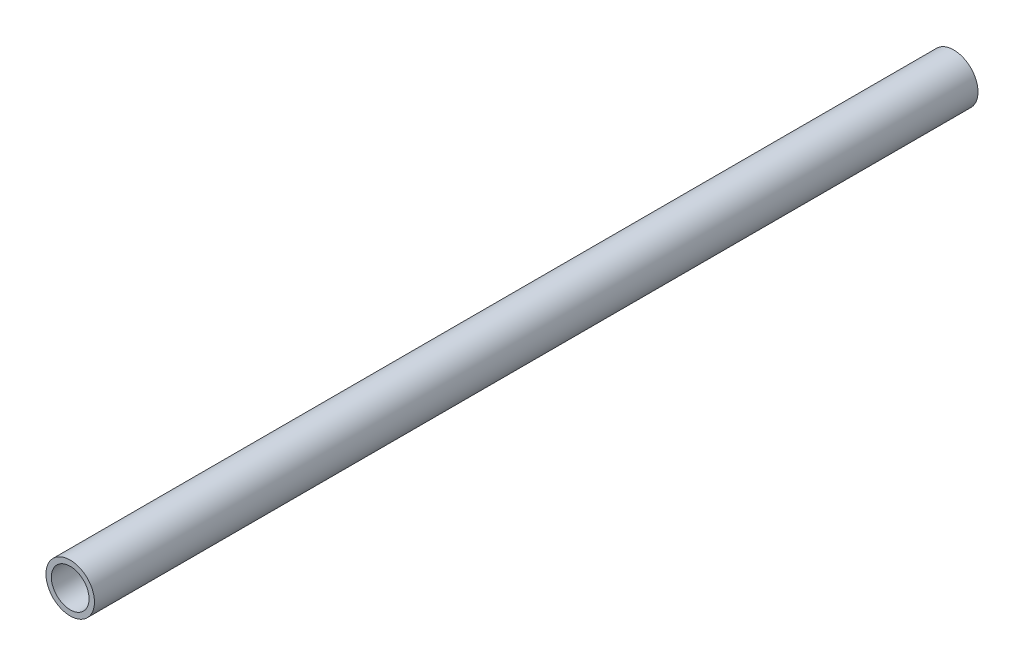
ISO-10303-21;
HEADER;
FILE_DESCRIPTION(('STEP AP214'),'2;1');
FILE_NAME('part.step','',(''),(''),'','','');
FILE_SCHEMA(('AUTOMOTIVE_DESIGN { 1 0 10303 214 1 1 1 1 }'));
ENDSEC;
DATA;
#1=APPLICATION_CONTEXT('core data for automotive mechanical design processes');
#2=APPLICATION_PROTOCOL_DEFINITION('international standard','automotive_design',2000,#1);
#3=PRODUCT_CONTEXT('',#1,'mechanical');
#4=PRODUCT('Part','Part','',(#3));
#5=PRODUCT_RELATED_PRODUCT_CATEGORY('part','',(#4));
#6=PRODUCT_DEFINITION_FORMATION('','',#4);
#7=PRODUCT_DEFINITION_CONTEXT('part definition',#1,'design');
#8=PRODUCT_DEFINITION('design','',#6,#7);
#9=PRODUCT_DEFINITION_SHAPE('','',#8);
#10=(LENGTH_UNIT() NAMED_UNIT(*) SI_UNIT(.MILLI.,.METRE.));
#11=(NAMED_UNIT(*) PLANE_ANGLE_UNIT() SI_UNIT($,.RADIAN.));
#12=(NAMED_UNIT(*) SI_UNIT($,.STERADIAN.) SOLID_ANGLE_UNIT());
#13=UNCERTAINTY_MEASURE_WITH_UNIT(LENGTH_MEASURE(1.E-05),#10,'distance_accuracy_value','');
#14=(GEOMETRIC_REPRESENTATION_CONTEXT(3) GLOBAL_UNCERTAINTY_ASSIGNED_CONTEXT((#13)) GLOBAL_UNIT_ASSIGNED_CONTEXT((#10,
#11,#12)) REPRESENTATION_CONTEXT('',''));
#15=CARTESIAN_POINT('',(0.,0.,0.));
#16=DIRECTION('',(0.,0.,1.));
#17=DIRECTION('',(1.,0.,0.));
#18=AXIS2_PLACEMENT_3D('',#15,#16,#17);
#19=CARTESIAN_POINT('',(0.,0.,327.978));
#20=DIRECTION('',(0.,0.,1.));
#21=DIRECTION('',(1.,0.,0.));
#22=AXIS2_PLACEMENT_3D('',#19,#20,#21);
#23=PLANE('',#22);
#24=CARTESIAN_POINT('',(0.,0.,327.978));
#25=DIRECTION('',(0.,0.,1.));
#26=DIRECTION('',(1.,0.,0.));
#27=AXIS2_PLACEMENT_3D('',#24,#25,#26);
#28=CIRCLE('',#27,9.);
#29=CARTESIAN_POINT('',(9.,0.,327.978));
#30=VERTEX_POINT('',#29);
#31=EDGE_CURVE('E10',#30,#30,#28,.T.);
#32=ORIENTED_EDGE('',*,*,#31,.T.);
#33=EDGE_LOOP('',(#32));
#34=FACE_BOUND('',#33,.T.);
#35=CARTESIAN_POINT('',(0.,0.,327.978));
#36=DIRECTION('',(0.,0.,1.));
#37=DIRECTION('',(1.,0.,0.));
#38=AXIS2_PLACEMENT_3D('',#35,#36,#37);
#39=CIRCLE('',#38,7.);
#40=CARTESIAN_POINT('',(7.,0.,327.978));
#41=VERTEX_POINT('',#40);
#42=EDGE_CURVE('E42',#41,#41,#39,.T.);
#43=ORIENTED_EDGE('',*,*,#42,.F.);
#44=EDGE_LOOP('',(#43));
#45=FACE_BOUND('',#44,.T.);
#46=ADVANCED_FACE('F31',(#34,#45),#23,.T.);
#47=CARTESIAN_POINT('',(0.,0.,0.));
#48=DIRECTION('',(0.,0.,1.));
#49=DIRECTION('',(1.,0.,0.));
#50=AXIS2_PLACEMENT_3D('',#47,#48,#49);
#51=PLANE('',#50);
#52=CARTESIAN_POINT('',(0.,0.,0.));
#53=DIRECTION('',(0.,0.,1.));
#54=DIRECTION('',(1.,0.,0.));
#55=AXIS2_PLACEMENT_3D('',#52,#53,#54);
#56=CIRCLE('',#55,9.);
#57=CARTESIAN_POINT('',(9.,0.,0.));
#58=VERTEX_POINT('',#57);
#59=EDGE_CURVE('E35',#58,#58,#56,.T.);
#60=ORIENTED_EDGE('',*,*,#59,.F.);
#61=EDGE_LOOP('',(#60));
#62=FACE_BOUND('',#61,.T.);
#63=CARTESIAN_POINT('',(0.,0.,0.));
#64=DIRECTION('',(0.,0.,1.));
#65=DIRECTION('',(1.,0.,0.));
#66=AXIS2_PLACEMENT_3D('',#63,#64,#65);
#67=CIRCLE('',#66,7.);
#68=CARTESIAN_POINT('',(7.,0.,0.));
#69=VERTEX_POINT('',#68);
#70=EDGE_CURVE('E44',#69,#69,#67,.T.);
#71=ORIENTED_EDGE('',*,*,#70,.T.);
#72=EDGE_LOOP('',(#71));
#73=FACE_BOUND('',#72,.T.);
#74=ADVANCED_FACE('F54',(#62,#73),#51,.F.);
#75=CARTESIAN_POINT('',(0.,0.,327.978));
#76=DIRECTION('',(0.,0.,-1.));
#77=DIRECTION('',(-1.,0.,0.));
#78=AXIS2_PLACEMENT_3D('',#75,#76,#77);
#79=CYLINDRICAL_SURFACE('',#78,9.);
#80=ORIENTED_EDGE('',*,*,#31,.F.);
#81=EDGE_LOOP('',(#80));
#82=FACE_BOUND('',#81,.T.);
#83=ORIENTED_EDGE('',*,*,#59,.T.);
#84=EDGE_LOOP('',(#83));
#85=FACE_BOUND('',#84,.T.);
#86=ADVANCED_FACE('F33',(#82,#85),#79,.T.);
#87=CARTESIAN_POINT('',(0.,0.,327.978));
#88=DIRECTION('',(0.,0.,-1.));
#89=DIRECTION('',(-1.,0.,0.));
#90=AXIS2_PLACEMENT_3D('',#87,#88,#89);
#91=CYLINDRICAL_SURFACE('',#90,7.);
#92=ORIENTED_EDGE('',*,*,#42,.T.);
#93=EDGE_LOOP('',(#92));
#94=FACE_BOUND('',#93,.T.);
#95=ORIENTED_EDGE('',*,*,#70,.F.);
#96=EDGE_LOOP('',(#95));
#97=FACE_BOUND('',#96,.T.);
#98=ADVANCED_FACE('F50',(#94,#97),#91,.F.);
#99=CLOSED_SHELL('',(#46,#74,#86,#98));
#100=MANIFOLD_SOLID_BREP('B2',#99);
#101=ADVANCED_BREP_SHAPE_REPRESENTATION('',(#18,#100),#14);
#102=SHAPE_DEFINITION_REPRESENTATION(#9,#101);
ENDSEC;
END-ISO-10303-21;
